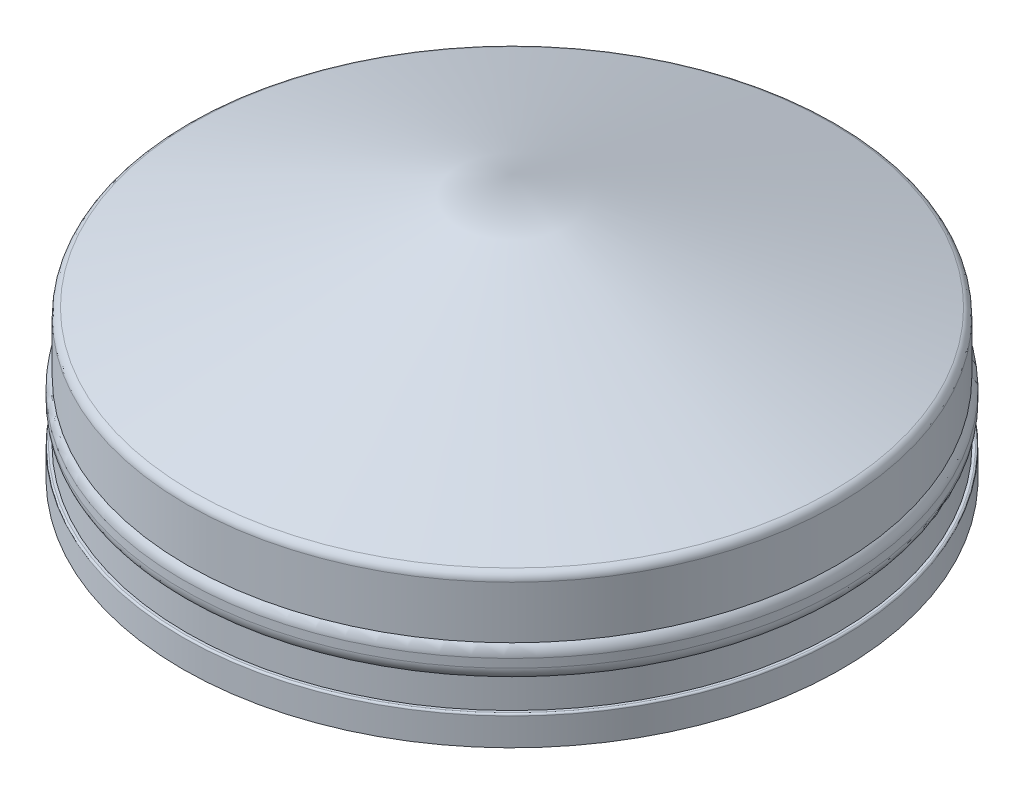
ISO-10303-21;
HEADER;
FILE_DESCRIPTION(('STEP AP214'),'2;1');
FILE_NAME('part.step','',(''),(''),'','','');
FILE_SCHEMA(('AUTOMOTIVE_DESIGN { 1 0 10303 214 1 1 1 1 }'));
ENDSEC;
DATA;
#1=APPLICATION_CONTEXT('core data for automotive mechanical design processes');
#2=APPLICATION_PROTOCOL_DEFINITION('international standard','automotive_design',2000,#1);
#3=PRODUCT_CONTEXT('',#1,'mechanical');
#4=PRODUCT('Part','Part','',(#3));
#5=PRODUCT_RELATED_PRODUCT_CATEGORY('part','',(#4));
#6=PRODUCT_DEFINITION_FORMATION('','',#4);
#7=PRODUCT_DEFINITION_CONTEXT('part definition',#1,'design');
#8=PRODUCT_DEFINITION('design','',#6,#7);
#9=PRODUCT_DEFINITION_SHAPE('','',#8);
#10=(LENGTH_UNIT() NAMED_UNIT(*) SI_UNIT(.MILLI.,.METRE.));
#11=(NAMED_UNIT(*) PLANE_ANGLE_UNIT() SI_UNIT($,.RADIAN.));
#12=(NAMED_UNIT(*) SI_UNIT($,.STERADIAN.) SOLID_ANGLE_UNIT());
#13=UNCERTAINTY_MEASURE_WITH_UNIT(LENGTH_MEASURE(1.E-05),#10,'distance_accuracy_value','');
#14=(GEOMETRIC_REPRESENTATION_CONTEXT(3) GLOBAL_UNCERTAINTY_ASSIGNED_CONTEXT((#13)) GLOBAL_UNIT_ASSIGNED_CONTEXT((#10,
#11,#12)) REPRESENTATION_CONTEXT('',''));
#15=CARTESIAN_POINT('',(0.,0.,0.));
#16=DIRECTION('',(0.,0.,1.));
#17=DIRECTION('',(1.,0.,0.));
#18=AXIS2_PLACEMENT_3D('',#15,#16,#17);
#19=CARTESIAN_POINT('',(0.,1.,0.));
#20=DIRECTION('',(0.,-1.,0.));
#21=DIRECTION('',(0.,0.,-1.));
#22=AXIS2_PLACEMENT_3D('',#19,#20,#21);
#23=CYLINDRICAL_SURFACE('',#22,11.25);
#24=CARTESIAN_POINT('',(0.,0.94,0.));
#25=DIRECTION('',(0.,1.,0.));
#26=DIRECTION('',(0.,0.,1.));
#27=AXIS2_PLACEMENT_3D('',#24,#25,#26);
#28=CIRCLE('',#27,11.25);
#29=CARTESIAN_POINT('',(0.,0.94,11.25));
#30=VERTEX_POINT('',#29);
#31=EDGE_CURVE('E11',#30,#30,#28,.F.);
#32=ORIENTED_EDGE('',*,*,#31,.T.);
#33=EDGE_LOOP('',(#32));
#34=FACE_BOUND('',#33,.T.);
#35=CARTESIAN_POINT('',(0.,0.,0.));
#36=DIRECTION('',(0.,1.,0.));
#37=DIRECTION('',(0.,0.,1.));
#38=AXIS2_PLACEMENT_3D('',#35,#36,#37);
#39=CIRCLE('',#38,11.25);
#40=CARTESIAN_POINT('',(0.,0.,11.25));
#41=VERTEX_POINT('',#40);
#42=EDGE_CURVE('E99',#41,#41,#39,.T.);
#43=ORIENTED_EDGE('',*,*,#42,.T.);
#44=EDGE_LOOP('',(#43));
#45=FACE_BOUND('',#44,.T.);
#46=ADVANCED_FACE('F36',(#34,#45),#23,.T.);
#47=CARTESIAN_POINT('',(0.,1.,0.));
#48=DIRECTION('',(0.,1.,0.));
#49=DIRECTION('',(0.,0.,1.));
#50=AXIS2_PLACEMENT_3D('',#47,#48,#49);
#51=PLANE('',#50);
#52=CARTESIAN_POINT('',(0.,1.,0.));
#53=DIRECTION('',(0.,1.,0.));
#54=DIRECTION('',(0.,0.,1.));
#55=AXIS2_PLACEMENT_3D('',#52,#53,#54);
#56=CIRCLE('',#55,11.19);
#57=CARTESIAN_POINT('',(0.,1.,11.19));
#58=VERTEX_POINT('',#57);
#59=EDGE_CURVE('E43',#58,#58,#56,.T.);
#60=ORIENTED_EDGE('',*,*,#59,.T.);
#61=EDGE_LOOP('',(#60));
#62=FACE_BOUND('',#61,.T.);
#63=CARTESIAN_POINT('',(0.,1.,0.));
#64=DIRECTION('',(0.,1.,0.));
#65=DIRECTION('',(0.,0.,1.));
#66=AXIS2_PLACEMENT_3D('',#63,#64,#65);
#67=CIRCLE('',#66,11.105);
#68=CARTESIAN_POINT('',(0.,1.,11.105));
#69=VERTEX_POINT('',#68);
#70=EDGE_CURVE('E94',#69,#69,#67,.T.);
#71=ORIENTED_EDGE('',*,*,#70,.F.);
#72=EDGE_LOOP('',(#71));
#73=FACE_BOUND('',#72,.T.);
#74=ADVANCED_FACE('F64',(#62,#73),#51,.T.);
#75=CARTESIAN_POINT('',(0.,0.,0.));
#76=DIRECTION('',(0.,1.,0.));
#77=DIRECTION('',(0.,0.,1.));
#78=AXIS2_PLACEMENT_3D('',#75,#76,#77);
#79=PLANE('',#78);
#80=ORIENTED_EDGE('',*,*,#42,.F.);
#81=EDGE_LOOP('',(#80));
#82=FACE_BOUND('',#81,.T.);
#83=ADVANCED_FACE('F70',(#82),#79,.F.);
#84=CARTESIAN_POINT('',(0.,2.,0.));
#85=DIRECTION('',(0.,-1.,0.));
#86=DIRECTION('',(0.,0.,-1.));
#87=AXIS2_PLACEMENT_3D('',#84,#85,#86);
#88=CYLINDRICAL_SURFACE('',#87,11.105);
#89=CARTESIAN_POINT('',(0.,2.,0.));
#90=DIRECTION('',(0.,1.,0.));
#91=DIRECTION('',(0.,0.,1.));
#92=AXIS2_PLACEMENT_3D('',#89,#90,#91);
#93=CIRCLE('',#92,11.105);
#94=CARTESIAN_POINT('',(0.,2.,11.105));
#95=VERTEX_POINT('',#94);
#96=EDGE_CURVE('E102',#95,#95,#93,.T.);
#97=ORIENTED_EDGE('',*,*,#96,.F.);
#98=EDGE_LOOP('',(#97));
#99=FACE_BOUND('',#98,.T.);
#100=ORIENTED_EDGE('',*,*,#70,.T.);
#101=EDGE_LOOP('',(#100));
#102=FACE_BOUND('',#101,.T.);
#103=ADVANCED_FACE('F118',(#99,#102),#88,.T.);
#104=CARTESIAN_POINT('',(0.,3.,0.));
#105=DIRECTION('',(0.,-1.,0.));
#106=DIRECTION('',(0.,0.,-1.));
#107=AXIS2_PLACEMENT_3D('',#104,#105,#106);
#108=CYLINDRICAL_SURFACE('',#107,11.25);
#109=CARTESIAN_POINT('',(0.,2.35210083782917,0.));
#110=DIRECTION('',(0.,-1.,0.));
#111=DIRECTION('',(0.,0.,-1.));
#112=AXIS2_PLACEMENT_3D('',#109,#110,#111);
#113=CIRCLE('',#112,11.25);
#114=CARTESIAN_POINT('',(0.,2.35210083782917,-11.25));
#115=VERTEX_POINT('',#114);
#116=EDGE_CURVE('E110',#115,#115,#113,.F.);
#117=ORIENTED_EDGE('',*,*,#116,.T.);
#118=EDGE_LOOP('',(#117));
#119=FACE_BOUND('',#118,.T.);
#120=CARTESIAN_POINT('',(0.,2.64292857857286,0.));
#121=DIRECTION('',(0.,1.,0.));
#122=DIRECTION('',(0.,0.,1.));
#123=AXIS2_PLACEMENT_3D('',#120,#121,#122);
#124=CIRCLE('',#123,11.25);
#125=CARTESIAN_POINT('',(0.,2.64292857857286,11.25));
#126=VERTEX_POINT('',#125);
#127=EDGE_CURVE('E88',#126,#126,#124,.F.);
#128=ORIENTED_EDGE('',*,*,#127,.T.);
#129=EDGE_LOOP('',(#128));
#130=FACE_BOUND('',#129,.T.);
#131=ADVANCED_FACE('F59',(#119,#130),#108,.T.);
#132=CARTESIAN_POINT('',(0.,5.,0.));
#133=DIRECTION('',(0.,-1.,0.));
#134=DIRECTION('',(0.,0.,-1.));
#135=AXIS2_PLACEMENT_3D('',#132,#133,#134);
#136=CYLINDRICAL_SURFACE('',#135,11.1);
#137=CARTESIAN_POINT('',(0.,4.78922354743024,0.));
#138=DIRECTION('',(0.,-1.,0.));
#139=DIRECTION('',(0.,0.,-1.));
#140=AXIS2_PLACEMENT_3D('',#137,#138,#139);
#141=CIRCLE('',#140,11.1);
#142=CARTESIAN_POINT('',(0.,4.78922354743024,-11.1));
#143=VERTEX_POINT('',#142);
#144=EDGE_CURVE('E96',#143,#143,#141,.T.);
#145=ORIENTED_EDGE('',*,*,#144,.T.);
#146=EDGE_LOOP('',(#145));
#147=FACE_BOUND('',#146,.T.);
#148=CARTESIAN_POINT('',(0.,3.,0.));
#149=DIRECTION('',(0.,1.,0.));
#150=DIRECTION('',(0.,0.,1.));
#151=AXIS2_PLACEMENT_3D('',#148,#149,#150);
#152=CIRCLE('',#151,11.1);
#153=CARTESIAN_POINT('',(0.,3.,11.1));
#154=VERTEX_POINT('',#153);
#155=EDGE_CURVE('E91',#154,#154,#152,.T.);
#156=ORIENTED_EDGE('',*,*,#155,.T.);
#157=EDGE_LOOP('',(#156));
#158=FACE_BOUND('',#157,.T.);
#159=ADVANCED_FACE('F49',(#147,#158),#136,.T.);
#160=CARTESIAN_POINT('',(0.,9.,0.));
#161=DIRECTION('',(0.,-1.,0.));
#162=DIRECTION('',(0.,0.,-1.));
#163=AXIS2_PLACEMENT_3D('',#160,#161,#162);
#164=CONICAL_SURFACE('',#163,0.,1.22492176695766);
#165=CARTESIAN_POINT('',(0.,5.07145734328629,0.));
#166=DIRECTION('',(0.,1.,0.));
#167=DIRECTION('',(0.,0.,1.));
#168=AXIS2_PLACEMENT_3D('',#165,#166,#167);
#169=CIRCLE('',#168,10.9017058723806);
#170=CARTESIAN_POINT('',(0.,5.07145734328629,10.9017058723806));
#171=VERTEX_POINT('',#170);
#172=EDGE_CURVE('E93',#171,#171,#169,.T.);
#173=ORIENTED_EDGE('',*,*,#172,.T.);
#174=EDGE_LOOP('',(#173));
#175=FACE_BOUND('',#174,.T.);
#176=CARTESIAN_POINT('',(0.,9.,0.));
#177=VERTEX_POINT('',#176);
#178=VERTEX_LOOP('',#177);
#179=FACE_BOUND('',#178,.T.);
#180=ADVANCED_FACE('F46',(#175,#179),#164,.T.);
#181=CARTESIAN_POINT('',(0.,4.78922354743024,0.));
#182=DIRECTION('',(0.,-1.,0.));
#183=DIRECTION('',(0.,0.,-1.));
#184=AXIS2_PLACEMENT_3D('',#181,#182,#183);
#185=TOROIDAL_SURFACE('',#184,10.8,0.3);
#186=ORIENTED_EDGE('',*,*,#144,.F.);
#187=EDGE_LOOP('',(#186));
#188=FACE_BOUND('',#187,.T.);
#189=ORIENTED_EDGE('',*,*,#172,.F.);
#190=EDGE_LOOP('',(#189));
#191=FACE_BOUND('',#190,.T.);
#192=ADVANCED_FACE('F48',(#188,#191),#185,.T.);
#193=CARTESIAN_POINT('',(0.,2.35210083782917,0.));
#194=DIRECTION('',(0.,-1.,0.));
#195=DIRECTION('',(0.,0.,-1.));
#196=AXIS2_PLACEMENT_3D('',#193,#194,#195);
#197=TOROIDAL_SURFACE('',#196,10.75,0.5);
#198=ORIENTED_EDGE('',*,*,#96,.T.);
#199=EDGE_LOOP('',(#198));
#200=FACE_BOUND('',#199,.T.);
#201=ORIENTED_EDGE('',*,*,#116,.F.);
#202=EDGE_LOOP('',(#201));
#203=FACE_BOUND('',#202,.T.);
#204=ADVANCED_FACE('F56',(#200,#203),#197,.T.);
#205=CARTESIAN_POINT('',(0.,2.64292857857286,0.));
#206=DIRECTION('',(0.,1.,0.));
#207=DIRECTION('',(0.,0.,1.));
#208=AXIS2_PLACEMENT_3D('',#205,#206,#207);
#209=TOROIDAL_SURFACE('',#208,10.75,0.5);
#210=ORIENTED_EDGE('',*,*,#127,.F.);
#211=EDGE_LOOP('',(#210));
#212=FACE_BOUND('',#211,.T.);
#213=ORIENTED_EDGE('',*,*,#155,.F.);
#214=EDGE_LOOP('',(#213));
#215=FACE_BOUND('',#214,.T.);
#216=ADVANCED_FACE('F77',(#212,#215),#209,.T.);
#217=CARTESIAN_POINT('',(0.,0.94,0.));
#218=DIRECTION('',(0.,1.,0.));
#219=DIRECTION('',(0.,0.,1.));
#220=AXIS2_PLACEMENT_3D('',#217,#218,#219);
#221=TOROIDAL_SURFACE('',#220,11.19,0.06);
#222=ORIENTED_EDGE('',*,*,#31,.F.);
#223=EDGE_LOOP('',(#222));
#224=FACE_BOUND('',#223,.T.);
#225=ORIENTED_EDGE('',*,*,#59,.F.);
#226=EDGE_LOOP('',(#225));
#227=FACE_BOUND('',#226,.T.);
#228=ADVANCED_FACE('F38',(#224,#227),#221,.T.);
#229=CLOSED_SHELL('',(#46,#74,#83,#103,#131,#159,#180,#192,#204,#216,#228));
#230=MANIFOLD_SOLID_BREP('B2',#229);
#231=ADVANCED_BREP_SHAPE_REPRESENTATION('',(#18,#230),#14);
#232=SHAPE_DEFINITION_REPRESENTATION(#9,#231);
ENDSEC;
END-ISO-10303-21;
